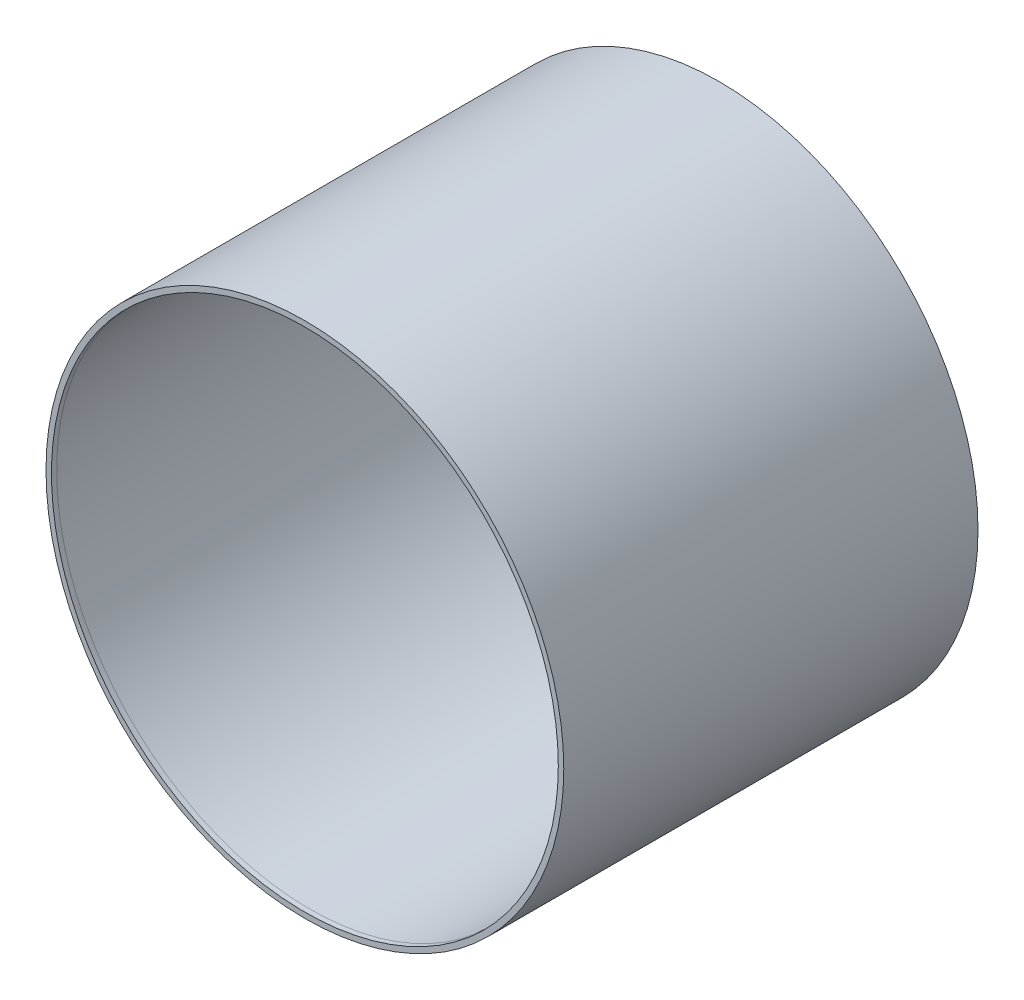
ISO-10303-21;
HEADER;
FILE_DESCRIPTION(('STEP AP214'),'2;1');
FILE_NAME('part.step','',(''),(''),'','','');
FILE_SCHEMA(('AUTOMOTIVE_DESIGN { 1 0 10303 214 1 1 1 1 }'));
ENDSEC;
DATA;
#1=APPLICATION_CONTEXT('core data for automotive mechanical design processes');
#2=APPLICATION_PROTOCOL_DEFINITION('international standard','automotive_design',2000,#1);
#3=PRODUCT_CONTEXT('',#1,'mechanical');
#4=PRODUCT('Part','Part','',(#3));
#5=PRODUCT_RELATED_PRODUCT_CATEGORY('part','',(#4));
#6=PRODUCT_DEFINITION_FORMATION('','',#4);
#7=PRODUCT_DEFINITION_CONTEXT('part definition',#1,'design');
#8=PRODUCT_DEFINITION('design','',#6,#7);
#9=PRODUCT_DEFINITION_SHAPE('','',#8);
#10=(LENGTH_UNIT() NAMED_UNIT(*) SI_UNIT(.MILLI.,.METRE.));
#11=(NAMED_UNIT(*) PLANE_ANGLE_UNIT() SI_UNIT($,.RADIAN.));
#12=(NAMED_UNIT(*) SI_UNIT($,.STERADIAN.) SOLID_ANGLE_UNIT());
#13=UNCERTAINTY_MEASURE_WITH_UNIT(LENGTH_MEASURE(1.E-05),#10,'distance_accuracy_value','');
#14=(GEOMETRIC_REPRESENTATION_CONTEXT(3) GLOBAL_UNCERTAINTY_ASSIGNED_CONTEXT((#13)) GLOBAL_UNIT_ASSIGNED_CONTEXT((#10,
#11,#12)) REPRESENTATION_CONTEXT('',''));
#15=CARTESIAN_POINT('',(0.,0.,0.));
#16=DIRECTION('',(0.,0.,1.));
#17=DIRECTION('',(1.,0.,0.));
#18=AXIS2_PLACEMENT_3D('',#15,#16,#17);
#19=CARTESIAN_POINT('',(0.,0.,80.));
#20=DIRECTION('',(0.,0.,-1.));
#21=DIRECTION('',(-1.,0.,0.));
#22=AXIS2_PLACEMENT_3D('',#19,#20,#21);
#23=CYLINDRICAL_SURFACE('',#22,50.);
#24=CARTESIAN_POINT('',(0.,0.,80.));
#25=DIRECTION('',(0.,0.,1.));
#26=DIRECTION('',(1.,0.,0.));
#27=AXIS2_PLACEMENT_3D('',#24,#25,#26);
#28=CIRCLE('',#27,50.);
#29=CARTESIAN_POINT('',(50.,0.,80.));
#30=VERTEX_POINT('',#29);
#31=EDGE_CURVE('E10',#30,#30,#28,.T.);
#32=ORIENTED_EDGE('',*,*,#31,.F.);
#33=EDGE_LOOP('',(#32));
#34=FACE_BOUND('',#33,.T.);
#35=CARTESIAN_POINT('',(0.,0.,0.));
#36=DIRECTION('',(0.,0.,1.));
#37=DIRECTION('',(1.,0.,0.));
#38=AXIS2_PLACEMENT_3D('',#35,#36,#37);
#39=CIRCLE('',#38,50.);
#40=CARTESIAN_POINT('',(50.,0.,0.));
#41=VERTEX_POINT('',#40);
#42=EDGE_CURVE('E36',#41,#41,#39,.T.);
#43=ORIENTED_EDGE('',*,*,#42,.T.);
#44=EDGE_LOOP('',(#43));
#45=FACE_BOUND('',#44,.T.);
#46=ADVANCED_FACE('F33',(#34,#45),#23,.T.);
#47=CARTESIAN_POINT('',(0.,0.,80.));
#48=DIRECTION('',(0.,0.,1.));
#49=DIRECTION('',(1.,0.,0.));
#50=AXIS2_PLACEMENT_3D('',#47,#48,#49);
#51=PLANE('',#50);
#52=CARTESIAN_POINT('',(0.,0.,80.));
#53=DIRECTION('',(0.,0.,1.));
#54=DIRECTION('',(1.,0.,0.));
#55=AXIS2_PLACEMENT_3D('',#52,#53,#54);
#56=CIRCLE('',#55,48.945);
#57=CARTESIAN_POINT('',(48.945,0.,80.));
#58=VERTEX_POINT('',#57);
#59=EDGE_CURVE('E51',#58,#58,#56,.T.);
#60=ORIENTED_EDGE('',*,*,#59,.F.);
#61=EDGE_LOOP('',(#60));
#62=FACE_BOUND('',#61,.T.);
#63=ORIENTED_EDGE('',*,*,#31,.T.);
#64=EDGE_LOOP('',(#63));
#65=FACE_BOUND('',#64,.T.);
#66=ADVANCED_FACE('F66',(#62,#65),#51,.T.);
#67=CARTESIAN_POINT('',(0.,0.,0.));
#68=DIRECTION('',(0.,0.,1.));
#69=DIRECTION('',(1.,0.,0.));
#70=AXIS2_PLACEMENT_3D('',#67,#68,#69);
#71=PLANE('',#70);
#72=CARTESIAN_POINT('',(0.,0.,0.));
#73=DIRECTION('',(0.,0.,1.));
#74=DIRECTION('',(1.,0.,0.));
#75=AXIS2_PLACEMENT_3D('',#72,#73,#74);
#76=CIRCLE('',#75,49.);
#77=CARTESIAN_POINT('',(49.,0.,0.));
#78=VERTEX_POINT('',#77);
#79=EDGE_CURVE('E45',#78,#78,#76,.T.);
#80=ORIENTED_EDGE('',*,*,#79,.T.);
#81=EDGE_LOOP('',(#80));
#82=FACE_BOUND('',#81,.T.);
#83=ORIENTED_EDGE('',*,*,#42,.F.);
#84=EDGE_LOOP('',(#83));
#85=FACE_BOUND('',#84,.T.);
#86=ADVANCED_FACE('F68',(#82,#85),#71,.F.);
#87=CARTESIAN_POINT('',(0.,0.,80.));
#88=DIRECTION('',(0.,0.,-1.));
#89=DIRECTION('',(-1.,0.,0.));
#90=AXIS2_PLACEMENT_3D('',#87,#88,#89);
#91=CYLINDRICAL_SURFACE('',#90,49.);
#92=CARTESIAN_POINT('',(0.,0.,79.));
#93=DIRECTION('',(0.,0.,1.));
#94=DIRECTION('',(1.,0.,0.));
#95=AXIS2_PLACEMENT_3D('',#92,#93,#94);
#96=CIRCLE('',#95,49.);
#97=CARTESIAN_POINT('',(49.,0.,79.));
#98=VERTEX_POINT('',#97);
#99=EDGE_CURVE('E43',#98,#98,#96,.T.);
#100=ORIENTED_EDGE('',*,*,#99,.T.);
#101=EDGE_LOOP('',(#100));
#102=FACE_BOUND('',#101,.T.);
#103=ORIENTED_EDGE('',*,*,#79,.F.);
#104=EDGE_LOOP('',(#103));
#105=FACE_BOUND('',#104,.T.);
#106=ADVANCED_FACE('F75',(#102,#105),#91,.F.);
#107=CARTESIAN_POINT('',(0.,0.,79.));
#108=DIRECTION('',(0.,0.,1.));
#109=DIRECTION('',(1.,0.,0.));
#110=AXIS2_PLACEMENT_3D('',#107,#108,#109);
#111=PLANE('',#110);
#112=CARTESIAN_POINT('',(0.,0.,79.));
#113=DIRECTION('',(0.,0.,1.));
#114=DIRECTION('',(1.,0.,0.));
#115=AXIS2_PLACEMENT_3D('',#112,#113,#114);
#116=CIRCLE('',#115,48.945);
#117=CARTESIAN_POINT('',(48.945,0.,79.));
#118=VERTEX_POINT('',#117);
#119=EDGE_CURVE('E48',#118,#118,#116,.T.);
#120=ORIENTED_EDGE('',*,*,#119,.T.);
#121=EDGE_LOOP('',(#120));
#122=FACE_BOUND('',#121,.T.);
#123=ORIENTED_EDGE('',*,*,#99,.F.);
#124=EDGE_LOOP('',(#123));
#125=FACE_BOUND('',#124,.T.);
#126=ADVANCED_FACE('F57',(#122,#125),#111,.F.);
#127=CARTESIAN_POINT('',(0.,0.,79.));
#128=DIRECTION('',(0.,0.,1.));
#129=DIRECTION('',(1.,0.,0.));
#130=AXIS2_PLACEMENT_3D('',#127,#128,#129);
#131=CYLINDRICAL_SURFACE('',#130,48.945);
#132=ORIENTED_EDGE('',*,*,#119,.F.);
#133=EDGE_LOOP('',(#132));
#134=FACE_BOUND('',#133,.T.);
#135=ORIENTED_EDGE('',*,*,#59,.T.);
#136=EDGE_LOOP('',(#135));
#137=FACE_BOUND('',#136,.T.);
#138=ADVANCED_FACE('F60',(#134,#137),#131,.F.);
#139=CLOSED_SHELL('',(#46,#66,#86,#106,#126,#138));
#140=MANIFOLD_SOLID_BREP('B2',#139);
#141=ADVANCED_BREP_SHAPE_REPRESENTATION('',(#18,#140),#14);
#142=SHAPE_DEFINITION_REPRESENTATION(#9,#141);
ENDSEC;
END-ISO-10303-21;
